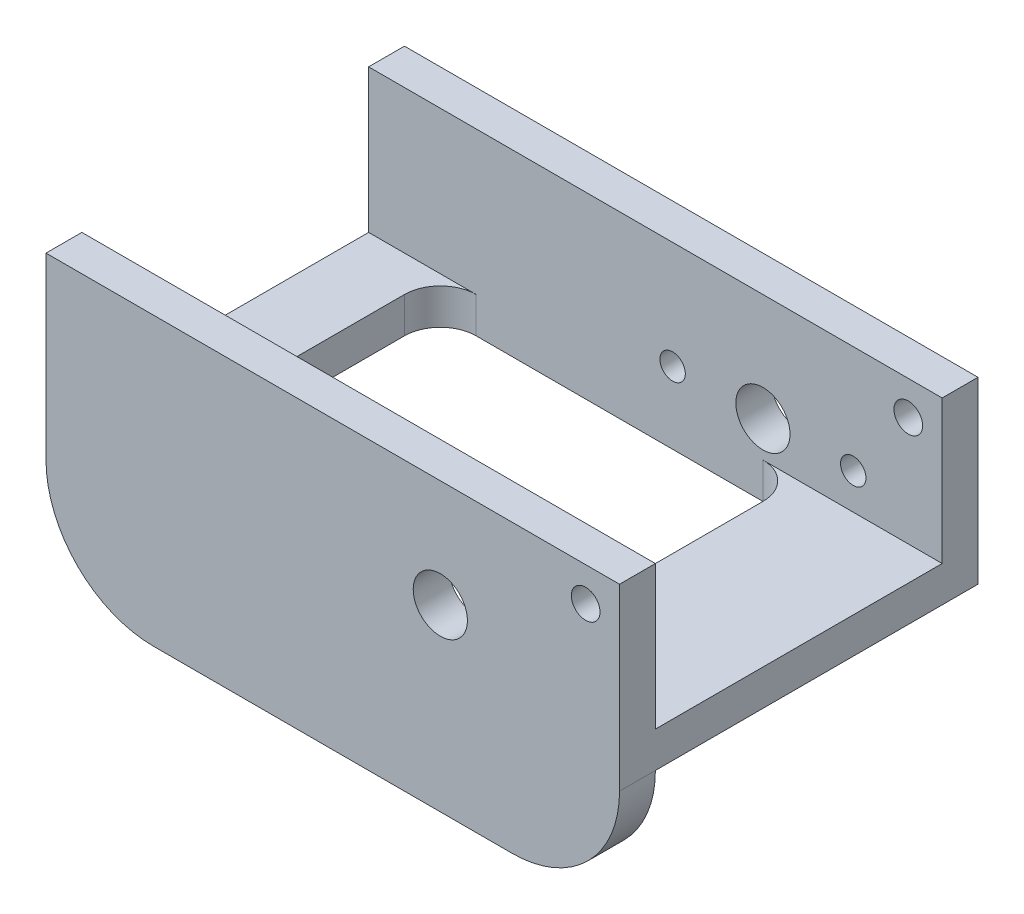
ISO-10303-21;
HEADER;
FILE_DESCRIPTION(('STEP AP214'),'2;1');
FILE_NAME('part.step','',(''),(''),'','','');
FILE_SCHEMA(('AUTOMOTIVE_DESIGN { 1 0 10303 214 1 1 1 1 }'));
ENDSEC;
DATA;
#1=APPLICATION_CONTEXT('core data for automotive mechanical design processes');
#2=APPLICATION_PROTOCOL_DEFINITION('international standard','automotive_design',2000,#1);
#3=PRODUCT_CONTEXT('',#1,'mechanical');
#4=PRODUCT('Part','Part','',(#3));
#5=PRODUCT_RELATED_PRODUCT_CATEGORY('part','',(#4));
#6=PRODUCT_DEFINITION_FORMATION('','',#4);
#7=PRODUCT_DEFINITION_CONTEXT('part definition',#1,'design');
#8=PRODUCT_DEFINITION('design','',#6,#7);
#9=PRODUCT_DEFINITION_SHAPE('','',#8);
#10=(LENGTH_UNIT() NAMED_UNIT(*) SI_UNIT(.MILLI.,.METRE.));
#11=(NAMED_UNIT(*) PLANE_ANGLE_UNIT() SI_UNIT($,.RADIAN.));
#12=(NAMED_UNIT(*) SI_UNIT($,.STERADIAN.) SOLID_ANGLE_UNIT());
#13=UNCERTAINTY_MEASURE_WITH_UNIT(LENGTH_MEASURE(1.E-05),#10,'distance_accuracy_value','');
#14=(GEOMETRIC_REPRESENTATION_CONTEXT(3) GLOBAL_UNCERTAINTY_ASSIGNED_CONTEXT((#13)) GLOBAL_UNIT_ASSIGNED_CONTEXT((#10,
#11,#12)) REPRESENTATION_CONTEXT('',''));
#15=CARTESIAN_POINT('',(0.,0.,0.));
#16=DIRECTION('',(0.,0.,1.));
#17=DIRECTION('',(1.,0.,0.));
#18=AXIS2_PLACEMENT_3D('',#15,#16,#17);
#19=CARTESIAN_POINT('',(-0.001000000000001,25.4,-57.15));
#20=DIRECTION('',(0.,-1.,0.));
#21=DIRECTION('',(0.,0.,-1.));
#22=AXIS2_PLACEMENT_3D('',#19,#20,#21);
#23=PLANE('',#22);
#24=DIRECTION('',(1.,0.,0.));
#25=VECTOR('',#24,1.);
#26=CARTESIAN_POINT('',(-0.001000000000001,25.4,-6.35));
#27=LINE('',#26,#25);
#28=CARTESIAN_POINT('',(0.,25.4,-6.35));
#29=VERTEX_POINT('',#28);
#30=CARTESIAN_POINT('',(19.05,25.4,-6.35));
#31=VERTEX_POINT('',#30);
#32=EDGE_CURVE('E340',#29,#31,#27,.T.);
#33=ORIENTED_EDGE('',*,*,#32,.T.);
#34=CARTESIAN_POINT('',(19.05,25.4,-12.7));
#35=DIRECTION('',(0.,-1.,0.));
#36=DIRECTION('',(0.,0.,-1.));
#37=AXIS2_PLACEMENT_3D('',#34,#35,#36);
#38=CIRCLE('',#37,6.35);
#39=CARTESIAN_POINT('',(12.7,25.4,-12.7));
#40=VERTEX_POINT('',#39);
#41=EDGE_CURVE('E47',#31,#40,#38,.T.);
#42=ORIENTED_EDGE('',*,*,#41,.T.);
#43=DIRECTION('',(0.,0.,1.));
#44=VECTOR('',#43,1.);
#45=CARTESIAN_POINT('',(12.7,25.4,-6.35));
#46=LINE('',#45,#44);
#47=CARTESIAN_POINT('',(12.7,25.4,-50.8));
#48=VERTEX_POINT('',#47);
#49=EDGE_CURVE('E352',#48,#40,#46,.T.);
#50=ORIENTED_EDGE('',*,*,#49,.F.);
#51=CARTESIAN_POINT('',(19.05,25.4,-50.8));
#52=DIRECTION('',(0.,-1.,0.));
#53=DIRECTION('',(0.,0.,-1.));
#54=AXIS2_PLACEMENT_3D('',#51,#52,#53);
#55=CIRCLE('',#54,6.35);
#56=CARTESIAN_POINT('',(19.05,25.4,-57.15));
#57=VERTEX_POINT('',#56);
#58=EDGE_CURVE('E61',#48,#57,#55,.T.);
#59=ORIENTED_EDGE('',*,*,#58,.T.);
#60=DIRECTION('',(1.,0.,0.));
#61=VECTOR('',#60,1.);
#62=CARTESIAN_POINT('',(-0.001000000000001,25.4,-57.15));
#63=LINE('',#62,#61);
#64=CARTESIAN_POINT('',(0.,25.4,-57.15));
#65=VERTEX_POINT('',#64);
#66=EDGE_CURVE('E217',#65,#57,#63,.T.);
#67=ORIENTED_EDGE('',*,*,#66,.F.);
#68=DIRECTION('',(0.,0.,1.));
#69=VECTOR('',#68,1.);
#70=CARTESIAN_POINT('',(0.,25.4,-57.15));
#71=LINE('',#70,#69);
#72=EDGE_CURVE('E194',#65,#29,#71,.T.);
#73=ORIENTED_EDGE('',*,*,#72,.T.);
#74=EDGE_LOOP('',(#33,#42,#50,#59,#67,#73));
#75=FACE_BOUND('',#74,.T.);
#76=ADVANCED_FACE('F39',(#75),#23,.F.);
#77=CARTESIAN_POINT('',(0.,50.8,0.));
#78=DIRECTION('',(0.,-1.,0.));
#79=DIRECTION('',(0.,0.,-1.));
#80=AXIS2_PLACEMENT_3D('',#77,#78,#79);
#81=PLANE('',#80);
#82=DIRECTION('',(0.,0.,1.));
#83=VECTOR('',#82,1.);
#84=CARTESIAN_POINT('',(0.,50.8,0.));
#85=LINE('',#84,#83);
#86=CARTESIAN_POINT('',(0.,50.8,-63.5));
#87=VERTEX_POINT('',#86);
#88=CARTESIAN_POINT('',(0.,50.8,-57.15));
#89=VERTEX_POINT('',#88);
#90=EDGE_CURVE('E191',#87,#89,#85,.T.);
#91=ORIENTED_EDGE('',*,*,#90,.T.);
#92=DIRECTION('',(1.,0.,0.));
#93=VECTOR('',#92,1.);
#94=CARTESIAN_POINT('',(-0.001000000000001,50.8,-57.15));
#95=LINE('',#94,#93);
#96=CARTESIAN_POINT('',(101.6,50.8,-57.15));
#97=VERTEX_POINT('',#96);
#98=EDGE_CURVE('E172',#89,#97,#95,.T.);
#99=ORIENTED_EDGE('',*,*,#98,.T.);
#100=DIRECTION('',(0.,0.,-1.));
#101=VECTOR('',#100,1.);
#102=CARTESIAN_POINT('',(101.6,50.8,0.));
#103=LINE('',#102,#101);
#104=CARTESIAN_POINT('',(101.6,50.8,-63.5));
#105=VERTEX_POINT('',#104);
#106=EDGE_CURVE('E203',#97,#105,#103,.T.);
#107=ORIENTED_EDGE('',*,*,#106,.T.);
#108=DIRECTION('',(-1.,0.,0.));
#109=VECTOR('',#108,1.);
#110=CARTESIAN_POINT('',(0.,50.8,-63.5));
#111=LINE('',#110,#109);
#112=EDGE_CURVE('E198',#105,#87,#111,.T.);
#113=ORIENTED_EDGE('',*,*,#112,.T.);
#114=EDGE_LOOP('',(#91,#99,#107,#113));
#115=FACE_BOUND('',#114,.T.);
#116=ADVANCED_FACE('F196',(#115),#81,.F.);
#117=CARTESIAN_POINT('',(0.,50.8,0.));
#118=DIRECTION('',(1.,0.,0.));
#119=DIRECTION('',(0.,0.,-1.));
#120=AXIS2_PLACEMENT_3D('',#117,#118,#119);
#121=PLANE('',#120);
#122=DIRECTION('',(0.,0.,-1.));
#123=VECTOR('',#122,1.);
#124=CARTESIAN_POINT('',(0.,19.05,-63.5));
#125=LINE('',#124,#123);
#126=CARTESIAN_POINT('',(0.,19.05,-6.35));
#127=VERTEX_POINT('',#126);
#128=CARTESIAN_POINT('',(0.,19.05,-63.5));
#129=VERTEX_POINT('',#128);
#130=EDGE_CURVE('E299',#127,#129,#125,.T.);
#131=ORIENTED_EDGE('',*,*,#130,.F.);
#132=DIRECTION('',(0.,0.,1.));
#133=VECTOR('',#132,1.);
#134=CARTESIAN_POINT('',(0.,19.05,0.));
#135=LINE('',#134,#133);
#136=CARTESIAN_POINT('',(0.,19.05,0.));
#137=VERTEX_POINT('',#136);
#138=EDGE_CURVE('E228',#127,#137,#135,.T.);
#139=ORIENTED_EDGE('',*,*,#138,.T.);
#140=DIRECTION('',(0.,-1.,0.));
#141=VECTOR('',#140,1.);
#142=CARTESIAN_POINT('',(0.,50.8,0.));
#143=LINE('',#142,#141);
#144=CARTESIAN_POINT('',(0.,50.8,0.));
#145=VERTEX_POINT('',#144);
#146=EDGE_CURVE('E225',#145,#137,#143,.T.);
#147=ORIENTED_EDGE('',*,*,#146,.F.);
#148=CARTESIAN_POINT('',(0.,50.8,-6.35));
#149=VERTEX_POINT('',#148);
#150=EDGE_CURVE('E201',#149,#145,#85,.T.);
#151=ORIENTED_EDGE('',*,*,#150,.F.);
#152=DIRECTION('',(0.,1.,0.));
#153=VECTOR('',#152,1.);
#154=CARTESIAN_POINT('',(0.,50.8,-6.35));
#155=LINE('',#154,#153);
#156=EDGE_CURVE('E356',#29,#149,#155,.T.);
#157=ORIENTED_EDGE('',*,*,#156,.F.);
#158=ORIENTED_EDGE('',*,*,#72,.F.);
#159=DIRECTION('',(0.,-1.,0.));
#160=VECTOR('',#159,1.);
#161=CARTESIAN_POINT('',(0.,50.8,-57.15));
#162=LINE('',#161,#160);
#163=EDGE_CURVE('E176',#89,#65,#162,.T.);
#164=ORIENTED_EDGE('',*,*,#163,.F.);
#165=ORIENTED_EDGE('',*,*,#90,.F.);
#166=DIRECTION('',(0.,-1.,0.));
#167=VECTOR('',#166,1.);
#168=CARTESIAN_POINT('',(0.,50.8,-63.5));
#169=LINE('',#168,#167);
#170=EDGE_CURVE('E214',#87,#129,#169,.T.);
#171=ORIENTED_EDGE('',*,*,#170,.T.);
#172=EDGE_LOOP('',(#131,#139,#147,#151,#157,#158,#164,#165,#171));
#173=FACE_BOUND('',#172,.T.);
#174=ADVANCED_FACE('F189',(#173),#121,.F.);
#175=CARTESIAN_POINT('',(0.,50.8,0.));
#176=DIRECTION('',(0.,0.,-1.));
#177=DIRECTION('',(-1.,0.,0.));
#178=AXIS2_PLACEMENT_3D('',#175,#176,#177);
#179=PLANE('',#178);
#180=CARTESIAN_POINT('',(95.6,44.8,0.));
#181=DIRECTION('',(0.,0.,-1.));
#182=DIRECTION('',(-1.,0.,0.));
#183=AXIS2_PLACEMENT_3D('',#180,#181,#182);
#184=CIRCLE('',#183,2.54);
#185=CARTESIAN_POINT('',(93.06,44.8,0.));
#186=VERTEX_POINT('',#185);
#187=EDGE_CURVE('E238',#186,#186,#184,.F.);
#188=ORIENTED_EDGE('',*,*,#187,.F.);
#189=EDGE_LOOP('',(#188));
#190=FACE_BOUND('',#189,.T.);
#191=CARTESIAN_POINT('',(69.85,31.75,0.));
#192=DIRECTION('',(0.,0.,-1.));
#193=DIRECTION('',(-1.,0.,0.));
#194=AXIS2_PLACEMENT_3D('',#191,#192,#193);
#195=CIRCLE('',#194,4.8);
#196=CARTESIAN_POINT('',(65.05,31.75,0.));
#197=VERTEX_POINT('',#196);
#198=EDGE_CURVE('E233',#197,#197,#195,.F.);
#199=ORIENTED_EDGE('',*,*,#198,.F.);
#200=EDGE_LOOP('',(#199));
#201=FACE_BOUND('',#200,.T.);
#202=ORIENTED_EDGE('',*,*,#146,.T.);
#203=CARTESIAN_POINT('',(19.05,19.05,0.));
#204=DIRECTION('',(0.,0.,-1.));
#205=DIRECTION('',(-1.,0.,0.));
#206=AXIS2_PLACEMENT_3D('',#203,#204,#205);
#207=CIRCLE('',#206,19.05);
#208=CARTESIAN_POINT('',(19.05,0.,0.));
#209=VERTEX_POINT('',#208);
#210=EDGE_CURVE('E243',#137,#209,#207,.F.);
#211=ORIENTED_EDGE('',*,*,#210,.T.);
#212=DIRECTION('',(1.,0.,0.));
#213=VECTOR('',#212,1.);
#214=CARTESIAN_POINT('',(0.,0.,0.));
#215=LINE('',#214,#213);
#216=CARTESIAN_POINT('',(82.55,0.,0.));
#217=VERTEX_POINT('',#216);
#218=EDGE_CURVE('E205',#209,#217,#215,.T.);
#219=ORIENTED_EDGE('',*,*,#218,.T.);
#220=CARTESIAN_POINT('',(82.55,19.05,0.));
#221=DIRECTION('',(0.,0.,-1.));
#222=DIRECTION('',(-1.,0.,0.));
#223=AXIS2_PLACEMENT_3D('',#220,#221,#222);
#224=CIRCLE('',#223,19.05);
#225=CARTESIAN_POINT('',(101.6,19.05,0.));
#226=VERTEX_POINT('',#225);
#227=EDGE_CURVE('E241',#217,#226,#224,.F.);
#228=ORIENTED_EDGE('',*,*,#227,.T.);
#229=DIRECTION('',(0.,-1.,0.));
#230=VECTOR('',#229,1.);
#231=CARTESIAN_POINT('',(101.6,50.8,0.));
#232=LINE('',#231,#230);
#233=CARTESIAN_POINT('',(101.6,50.8,0.));
#234=VERTEX_POINT('',#233);
#235=EDGE_CURVE('E222',#234,#226,#232,.T.);
#236=ORIENTED_EDGE('',*,*,#235,.F.);
#237=DIRECTION('',(1.,0.,0.));
#238=VECTOR('',#237,1.);
#239=CARTESIAN_POINT('',(0.,50.8,0.));
#240=LINE('',#239,#238);
#241=EDGE_CURVE('E200',#145,#234,#240,.T.);
#242=ORIENTED_EDGE('',*,*,#241,.F.);
#243=EDGE_LOOP('',(#202,#211,#219,#228,#236,#242));
#244=FACE_BOUND('',#243,.T.);
#245=ADVANCED_FACE('F399',(#190,#201,#244),#179,.F.);
#246=CARTESIAN_POINT('',(101.6,50.8,0.));
#247=DIRECTION('',(-1.,0.,0.));
#248=DIRECTION('',(0.,0.,1.));
#249=AXIS2_PLACEMENT_3D('',#246,#247,#248);
#250=PLANE('',#249);
#251=ORIENTED_EDGE('',*,*,#235,.T.);
#252=DIRECTION('',(0.,0.,-1.));
#253=VECTOR('',#252,1.);
#254=CARTESIAN_POINT('',(101.6,19.05,-6.35));
#255=LINE('',#254,#253);
#256=CARTESIAN_POINT('',(101.6,19.05,-6.35));
#257=VERTEX_POINT('',#256);
#258=EDGE_CURVE('E253',#226,#257,#255,.T.);
#259=ORIENTED_EDGE('',*,*,#258,.T.);
#260=DIRECTION('',(0.,0.,1.));
#261=VECTOR('',#260,1.);
#262=CARTESIAN_POINT('',(101.6,19.05,-63.5));
#263=LINE('',#262,#261);
#264=CARTESIAN_POINT('',(101.6,19.05,-63.5));
#265=VERTEX_POINT('',#264);
#266=EDGE_CURVE('E207',#265,#257,#263,.T.);
#267=ORIENTED_EDGE('',*,*,#266,.F.);
#268=DIRECTION('',(0.,-1.,0.));
#269=VECTOR('',#268,1.);
#270=CARTESIAN_POINT('',(101.6,50.8,-63.5));
#271=LINE('',#270,#269);
#272=EDGE_CURVE('E219',#105,#265,#271,.T.);
#273=ORIENTED_EDGE('',*,*,#272,.F.);
#274=ORIENTED_EDGE('',*,*,#106,.F.);
#275=DIRECTION('',(0.,1.,0.));
#276=VECTOR('',#275,1.);
#277=CARTESIAN_POINT('',(101.6,50.8,-57.15));
#278=LINE('',#277,#276);
#279=CARTESIAN_POINT('',(101.6,25.4,-57.15));
#280=VERTEX_POINT('',#279);
#281=EDGE_CURVE('E179',#280,#97,#278,.T.);
#282=ORIENTED_EDGE('',*,*,#281,.F.);
#283=DIRECTION('',(0.,0.,-1.));
#284=VECTOR('',#283,1.);
#285=CARTESIAN_POINT('',(101.6,25.4,-57.15));
#286=LINE('',#285,#284);
#287=CARTESIAN_POINT('',(101.6,25.4,-6.35));
#288=VERTEX_POINT('',#287);
#289=EDGE_CURVE('E184',#288,#280,#286,.T.);
#290=ORIENTED_EDGE('',*,*,#289,.F.);
#291=DIRECTION('',(0.,-1.,0.));
#292=VECTOR('',#291,1.);
#293=CARTESIAN_POINT('',(101.6,50.8,-6.35));
#294=LINE('',#293,#292);
#295=CARTESIAN_POINT('',(101.6,50.8,-6.35));
#296=VERTEX_POINT('',#295);
#297=EDGE_CURVE('E360',#296,#288,#294,.T.);
#298=ORIENTED_EDGE('',*,*,#297,.F.);
#299=EDGE_CURVE('E210',#234,#296,#103,.T.);
#300=ORIENTED_EDGE('',*,*,#299,.F.);
#301=EDGE_LOOP('',(#251,#259,#267,#273,#274,#282,#290,#298,#300));
#302=FACE_BOUND('',#301,.T.);
#303=ADVANCED_FACE('F386',(#302),#250,.F.);
#304=CARTESIAN_POINT('',(0.,50.8,-63.5));
#305=DIRECTION('',(0.,0.,1.));
#306=DIRECTION('',(1.,0.,0.));
#307=AXIS2_PLACEMENT_3D('',#304,#305,#306);
#308=PLANE('',#307);
#309=CARTESIAN_POINT('',(95.6,44.8,-63.5));
#310=DIRECTION('',(0.,0.,-1.));
#311=DIRECTION('',(-1.,0.,0.));
#312=AXIS2_PLACEMENT_3D('',#309,#310,#311);
#313=CIRCLE('',#312,2.54);
#314=CARTESIAN_POINT('',(93.06,44.8,-63.5));
#315=VERTEX_POINT('',#314);
#316=EDGE_CURVE('E451',#315,#315,#313,.T.);
#317=ORIENTED_EDGE('',*,*,#316,.F.);
#318=EDGE_LOOP('',(#317));
#319=FACE_BOUND('',#318,.T.);
#320=CARTESIAN_POINT('',(69.85,31.75,-63.5));
#321=DIRECTION('',(0.,0.,-1.));
#322=DIRECTION('',(-1.,0.,0.));
#323=AXIS2_PLACEMENT_3D('',#320,#321,#322);
#324=CIRCLE('',#323,4.8);
#325=CARTESIAN_POINT('',(65.05,31.75,-63.5));
#326=VERTEX_POINT('',#325);
#327=EDGE_CURVE('E454',#326,#326,#324,.T.);
#328=ORIENTED_EDGE('',*,*,#327,.F.);
#329=EDGE_LOOP('',(#328));
#330=FACE_BOUND('',#329,.T.);
#331=CARTESIAN_POINT('',(85.85,31.75,-63.5));
#332=DIRECTION('',(0.,0.,-1.));
#333=DIRECTION('',(-1.,0.,0.));
#334=AXIS2_PLACEMENT_3D('',#331,#332,#333);
#335=CIRCLE('',#334,2.25);
#336=CARTESIAN_POINT('',(83.6,31.75,-63.5));
#337=VERTEX_POINT('',#336);
#338=EDGE_CURVE('E466',#337,#337,#335,.T.);
#339=ORIENTED_EDGE('',*,*,#338,.F.);
#340=EDGE_LOOP('',(#339));
#341=FACE_BOUND('',#340,.T.);
#342=CARTESIAN_POINT('',(53.85,31.75,-63.5));
#343=DIRECTION('',(0.,0.,-1.));
#344=DIRECTION('',(-1.,0.,0.));
#345=AXIS2_PLACEMENT_3D('',#342,#343,#344);
#346=CIRCLE('',#345,2.25);
#347=CARTESIAN_POINT('',(51.6,31.75,-63.5));
#348=VERTEX_POINT('',#347);
#349=EDGE_CURVE('E465',#348,#348,#346,.T.);
#350=ORIENTED_EDGE('',*,*,#349,.F.);
#351=EDGE_LOOP('',(#350));
#352=FACE_BOUND('',#351,.T.);
#353=ORIENTED_EDGE('',*,*,#272,.T.);
#354=DIRECTION('',(1.,0.,0.));
#355=VECTOR('',#354,1.);
#356=CARTESIAN_POINT('',(-0.001000000000001,19.05,-63.5));
#357=LINE('',#356,#355);
#358=EDGE_CURVE('E369',#129,#265,#357,.T.);
#359=ORIENTED_EDGE('',*,*,#358,.F.);
#360=ORIENTED_EDGE('',*,*,#170,.F.);
#361=ORIENTED_EDGE('',*,*,#112,.F.);
#362=EDGE_LOOP('',(#353,#359,#360,#361));
#363=FACE_BOUND('',#362,.T.);
#364=ADVANCED_FACE('F389',(#319,#330,#341,#352,#363),#308,.F.);
#365=ORIENTED_EDGE('',*,*,#299,.T.);
#366=DIRECTION('',(1.,0.,0.));
#367=VECTOR('',#366,1.);
#368=CARTESIAN_POINT('',(-0.001000000000001,50.8,-6.35));
#369=LINE('',#368,#367);
#370=EDGE_CURVE('E183',#149,#296,#369,.T.);
#371=ORIENTED_EDGE('',*,*,#370,.F.);
#372=ORIENTED_EDGE('',*,*,#150,.T.);
#373=ORIENTED_EDGE('',*,*,#241,.T.);
#374=EDGE_LOOP('',(#365,#371,#372,#373));
#375=FACE_BOUND('',#374,.T.);
#376=ADVANCED_FACE('F321',(#375),#81,.F.);
#377=CARTESIAN_POINT('',(0.,0.,0.));
#378=DIRECTION('',(0.,-1.,0.));
#379=DIRECTION('',(0.,0.,-1.));
#380=AXIS2_PLACEMENT_3D('',#377,#378,#379);
#381=PLANE('',#380);
#382=ORIENTED_EDGE('',*,*,#218,.F.);
#383=DIRECTION('',(0.,0.,1.));
#384=VECTOR('',#383,1.);
#385=CARTESIAN_POINT('',(19.05,0.,-6.35));
#386=LINE('',#385,#384);
#387=CARTESIAN_POINT('',(19.05,0.,-6.35));
#388=VERTEX_POINT('',#387);
#389=EDGE_CURVE('E247',#209,#388,#386,.F.);
#390=ORIENTED_EDGE('',*,*,#389,.T.);
#391=DIRECTION('',(1.,0.,0.));
#392=VECTOR('',#391,1.);
#393=CARTESIAN_POINT('',(-0.001000000000001,0.,-6.35));
#394=LINE('',#393,#392);
#395=CARTESIAN_POINT('',(82.55,0.,-6.35));
#396=VERTEX_POINT('',#395);
#397=EDGE_CURVE('E368',#388,#396,#394,.T.);
#398=ORIENTED_EDGE('',*,*,#397,.T.);
#399=DIRECTION('',(0.,0.,-1.));
#400=VECTOR('',#399,1.);
#401=CARTESIAN_POINT('',(82.55,0.,0.));
#402=LINE('',#401,#400);
#403=EDGE_CURVE('E245',#396,#217,#402,.F.);
#404=ORIENTED_EDGE('',*,*,#403,.T.);
#405=EDGE_LOOP('',(#382,#390,#398,#404));
#406=FACE_BOUND('',#405,.T.);
#407=ADVANCED_FACE('F402',(#406),#381,.T.);
#408=CARTESIAN_POINT('',(-0.001000000000001,19.05,-63.5));
#409=DIRECTION('',(0.,1.,0.));
#410=DIRECTION('',(0.,0.,1.));
#411=AXIS2_PLACEMENT_3D('',#408,#409,#410);
#412=PLANE('',#411);
#413=DIRECTION('',(1.,0.,0.));
#414=VECTOR('',#413,1.);
#415=CARTESIAN_POINT('',(12.7,19.05,-57.15));
#416=LINE('',#415,#414);
#417=CARTESIAN_POINT('',(19.05,19.05,-57.15));
#418=VERTEX_POINT('',#417);
#419=CARTESIAN_POINT('',(69.85,19.05,-57.15));
#420=VERTEX_POINT('',#419);
#421=EDGE_CURVE('E295',#418,#420,#416,.T.);
#422=ORIENTED_EDGE('',*,*,#421,.F.);
#423=CARTESIAN_POINT('',(19.05,19.05,-50.8));
#424=DIRECTION('',(0.,1.,0.));
#425=DIRECTION('',(0.,0.,1.));
#426=AXIS2_PLACEMENT_3D('',#423,#424,#425);
#427=CIRCLE('',#426,6.35);
#428=CARTESIAN_POINT('',(12.7,19.05,-50.8));
#429=VERTEX_POINT('',#428);
#430=EDGE_CURVE('E286',#418,#429,#427,.T.);
#431=ORIENTED_EDGE('',*,*,#430,.T.);
#432=DIRECTION('',(0.,0.,-1.));
#433=VECTOR('',#432,1.);
#434=CARTESIAN_POINT('',(12.7,19.05,-6.35000000000001));
#435=LINE('',#434,#433);
#436=CARTESIAN_POINT('',(12.7,19.05,-12.7));
#437=VERTEX_POINT('',#436);
#438=EDGE_CURVE('E293',#437,#429,#435,.T.);
#439=ORIENTED_EDGE('',*,*,#438,.F.);
#440=CARTESIAN_POINT('',(19.05,19.05,-12.7));
#441=DIRECTION('',(0.,1.,0.));
#442=DIRECTION('',(0.,0.,1.));
#443=AXIS2_PLACEMENT_3D('',#440,#441,#442);
#444=CIRCLE('',#443,6.35);
#445=CARTESIAN_POINT('',(19.05,19.05,-6.35));
#446=VERTEX_POINT('',#445);
#447=EDGE_CURVE('E11',#437,#446,#444,.T.);
#448=ORIENTED_EDGE('',*,*,#447,.T.);
#449=DIRECTION('',(1.,0.,0.));
#450=VECTOR('',#449,1.);
#451=CARTESIAN_POINT('',(-0.001000000000001,19.05,-6.35));
#452=LINE('',#451,#450);
#453=EDGE_CURVE('E371',#127,#446,#452,.T.);
#454=ORIENTED_EDGE('',*,*,#453,.F.);
#455=ORIENTED_EDGE('',*,*,#130,.T.);
#456=ORIENTED_EDGE('',*,*,#358,.T.);
#457=ORIENTED_EDGE('',*,*,#266,.T.);
#458=CARTESIAN_POINT('',(69.85,19.05,-6.35));
#459=VERTEX_POINT('',#458);
#460=EDGE_CURVE('E372',#459,#257,#452,.T.);
#461=ORIENTED_EDGE('',*,*,#460,.F.);
#462=CARTESIAN_POINT('',(69.85,19.05,-12.7));
#463=DIRECTION('',(0.,1.,0.));
#464=DIRECTION('',(0.,0.,1.));
#465=AXIS2_PLACEMENT_3D('',#462,#463,#464);
#466=CIRCLE('',#465,6.35);
#467=CARTESIAN_POINT('',(76.2,19.05,-12.7));
#468=VERTEX_POINT('',#467);
#469=EDGE_CURVE('E279',#459,#468,#466,.T.);
#470=ORIENTED_EDGE('',*,*,#469,.T.);
#471=DIRECTION('',(0.,0.,1.));
#472=VECTOR('',#471,1.);
#473=CARTESIAN_POINT('',(76.2,19.05,-6.35000000000001));
#474=LINE('',#473,#472);
#475=CARTESIAN_POINT('',(76.2,19.05,-50.8));
#476=VERTEX_POINT('',#475);
#477=EDGE_CURVE('E345',#476,#468,#474,.T.);
#478=ORIENTED_EDGE('',*,*,#477,.F.);
#479=CARTESIAN_POINT('',(69.85,19.05,-50.8));
#480=DIRECTION('',(0.,1.,0.));
#481=DIRECTION('',(0.,0.,1.));
#482=AXIS2_PLACEMENT_3D('',#479,#480,#481);
#483=CIRCLE('',#482,6.35);
#484=EDGE_CURVE('E283',#476,#420,#483,.T.);
#485=ORIENTED_EDGE('',*,*,#484,.T.);
#486=EDGE_LOOP('',(#422,#431,#439,#448,#454,#455,#456,#457,#461,#470,#478,#485));
#487=FACE_BOUND('',#486,.T.);
#488=ADVANCED_FACE('F292',(#487),#412,.F.);
#489=CARTESIAN_POINT('',(-0.001000000000001,50.8,-57.15));
#490=DIRECTION('',(0.,0.,-1.));
#491=DIRECTION('',(-1.,0.,0.));
#492=AXIS2_PLACEMENT_3D('',#489,#490,#491);
#493=PLANE('',#492);
#494=CARTESIAN_POINT('',(95.6,44.8,-57.15));
#495=DIRECTION('',(0.,0.,-1.));
#496=DIRECTION('',(-1.,0.,0.));
#497=AXIS2_PLACEMENT_3D('',#494,#495,#496);
#498=CIRCLE('',#497,2.54);
#499=CARTESIAN_POINT('',(93.06,44.8,-57.15));
#500=VERTEX_POINT('',#499);
#501=EDGE_CURVE('E237',#500,#500,#498,.T.);
#502=ORIENTED_EDGE('',*,*,#501,.T.);
#503=EDGE_LOOP('',(#502));
#504=FACE_BOUND('',#503,.T.);
#505=CARTESIAN_POINT('',(69.85,31.75,-57.15));
#506=DIRECTION('',(0.,0.,-1.));
#507=DIRECTION('',(-1.,0.,0.));
#508=AXIS2_PLACEMENT_3D('',#505,#506,#507);
#509=CIRCLE('',#508,4.8);
#510=CARTESIAN_POINT('',(65.05,31.75,-57.15));
#511=VERTEX_POINT('',#510);
#512=EDGE_CURVE('E232',#511,#511,#509,.T.);
#513=ORIENTED_EDGE('',*,*,#512,.T.);
#514=EDGE_LOOP('',(#513));
#515=FACE_BOUND('',#514,.T.);
#516=CARTESIAN_POINT('',(85.85,31.75,-57.15));
#517=DIRECTION('',(0.,0.,-1.));
#518=DIRECTION('',(-1.,0.,0.));
#519=AXIS2_PLACEMENT_3D('',#516,#517,#518);
#520=CIRCLE('',#519,2.25);
#521=CARTESIAN_POINT('',(83.6,31.75,-57.15));
#522=VERTEX_POINT('',#521);
#523=EDGE_CURVE('E354',#522,#522,#520,.F.);
#524=ORIENTED_EDGE('',*,*,#523,.F.);
#525=EDGE_LOOP('',(#524));
#526=FACE_BOUND('',#525,.T.);
#527=CARTESIAN_POINT('',(53.85,31.75,-57.15));
#528=DIRECTION('',(0.,0.,-1.));
#529=DIRECTION('',(-1.,0.,0.));
#530=AXIS2_PLACEMENT_3D('',#527,#528,#529);
#531=CIRCLE('',#530,2.25);
#532=CARTESIAN_POINT('',(51.6,31.75,-57.15));
#533=VERTEX_POINT('',#532);
#534=EDGE_CURVE('E469',#533,#533,#531,.F.);
#535=ORIENTED_EDGE('',*,*,#534,.F.);
#536=EDGE_LOOP('',(#535));
#537=FACE_BOUND('',#536,.T.);
#538=ORIENTED_EDGE('',*,*,#421,.T.);
#539=DIRECTION('',(0.,1.,0.));
#540=VECTOR('',#539,1.);
#541=CARTESIAN_POINT('',(69.85,25.4,-57.15));
#542=LINE('',#541,#540);
#543=CARTESIAN_POINT('',(69.85,25.4,-57.15));
#544=VERTEX_POINT('',#543);
#545=EDGE_CURVE('E269',#420,#544,#542,.T.);
#546=ORIENTED_EDGE('',*,*,#545,.T.);
#547=EDGE_CURVE('E335',#544,#280,#63,.T.);
#548=ORIENTED_EDGE('',*,*,#547,.T.);
#549=ORIENTED_EDGE('',*,*,#281,.T.);
#550=ORIENTED_EDGE('',*,*,#98,.F.);
#551=ORIENTED_EDGE('',*,*,#163,.T.);
#552=ORIENTED_EDGE('',*,*,#66,.T.);
#553=DIRECTION('',(0.,1.,0.));
#554=VECTOR('',#553,1.);
#555=CARTESIAN_POINT('',(19.05,19.05,-57.15));
#556=LINE('',#555,#554);
#557=EDGE_CURVE('E267',#57,#418,#556,.F.);
#558=ORIENTED_EDGE('',*,*,#557,.T.);
#559=EDGE_LOOP('',(#538,#546,#548,#549,#550,#551,#552,#558));
#560=FACE_BOUND('',#559,.T.);
#561=ADVANCED_FACE('F175',(#504,#515,#526,#537,#560),#493,.F.);
#562=ORIENTED_EDGE('',*,*,#547,.F.);
#563=CARTESIAN_POINT('',(69.85,25.4,-50.8));
#564=DIRECTION('',(0.,-1.,0.));
#565=DIRECTION('',(0.,0.,-1.));
#566=AXIS2_PLACEMENT_3D('',#563,#564,#565);
#567=CIRCLE('',#566,6.35);
#568=CARTESIAN_POINT('',(76.2,25.4,-50.8));
#569=VERTEX_POINT('',#568);
#570=EDGE_CURVE('E281',#544,#569,#567,.T.);
#571=ORIENTED_EDGE('',*,*,#570,.T.);
#572=DIRECTION('',(0.,0.,-1.));
#573=VECTOR('',#572,1.);
#574=CARTESIAN_POINT('',(76.2,25.4,-6.35));
#575=LINE('',#574,#573);
#576=CARTESIAN_POINT('',(76.2,25.4,-12.7));
#577=VERTEX_POINT('',#576);
#578=EDGE_CURVE('E348',#577,#569,#575,.T.);
#579=ORIENTED_EDGE('',*,*,#578,.F.);
#580=CARTESIAN_POINT('',(69.85,25.4,-12.7));
#581=DIRECTION('',(0.,-1.,0.));
#582=DIRECTION('',(0.,0.,-1.));
#583=AXIS2_PLACEMENT_3D('',#580,#581,#582);
#584=CIRCLE('',#583,6.35);
#585=CARTESIAN_POINT('',(69.85,25.4,-6.35));
#586=VERTEX_POINT('',#585);
#587=EDGE_CURVE('E276',#577,#586,#584,.T.);
#588=ORIENTED_EDGE('',*,*,#587,.T.);
#589=EDGE_CURVE('E365',#586,#288,#27,.T.);
#590=ORIENTED_EDGE('',*,*,#589,.T.);
#591=ORIENTED_EDGE('',*,*,#289,.T.);
#592=EDGE_LOOP('',(#562,#571,#579,#588,#590,#591));
#593=FACE_BOUND('',#592,.T.);
#594=ADVANCED_FACE('F314',(#593),#23,.F.);
#595=CARTESIAN_POINT('',(-0.001000000000001,50.8,-6.35));
#596=DIRECTION('',(0.,0.,1.));
#597=DIRECTION('',(0.,-1.,0.));
#598=AXIS2_PLACEMENT_3D('',#595,#596,#597);
#599=PLANE('',#598);
#600=CARTESIAN_POINT('',(95.6,44.8,-6.35));
#601=DIRECTION('',(0.,0.,1.));
#602=DIRECTION('',(0.,-1.,0.));
#603=AXIS2_PLACEMENT_3D('',#600,#601,#602);
#604=CIRCLE('',#603,2.54);
#605=CARTESIAN_POINT('',(95.6,42.26,-6.35));
#606=VERTEX_POINT('',#605);
#607=EDGE_CURVE('E234',#606,#606,#604,.T.);
#608=ORIENTED_EDGE('',*,*,#607,.T.);
#609=EDGE_LOOP('',(#608));
#610=FACE_BOUND('',#609,.T.);
#611=CARTESIAN_POINT('',(69.85,31.75,-6.35));
#612=DIRECTION('',(0.,0.,1.));
#613=DIRECTION('',(0.,-1.,0.));
#614=AXIS2_PLACEMENT_3D('',#611,#612,#613);
#615=CIRCLE('',#614,4.8);
#616=CARTESIAN_POINT('',(69.85,26.95,-6.35000000000001));
#617=VERTEX_POINT('',#616);
#618=EDGE_CURVE('E229',#617,#617,#615,.T.);
#619=ORIENTED_EDGE('',*,*,#618,.T.);
#620=EDGE_LOOP('',(#619));
#621=FACE_BOUND('',#620,.T.);
#622=ORIENTED_EDGE('',*,*,#589,.F.);
#623=DIRECTION('',(0.,1.,0.));
#624=VECTOR('',#623,1.);
#625=CARTESIAN_POINT('',(69.85,19.05,-6.35));
#626=LINE('',#625,#624);
#627=EDGE_CURVE('E264',#586,#459,#626,.F.);
#628=ORIENTED_EDGE('',*,*,#627,.T.);
#629=ORIENTED_EDGE('',*,*,#460,.T.);
#630=CARTESIAN_POINT('',(82.55,19.05,-6.35));
#631=DIRECTION('',(0.,0.,1.));
#632=DIRECTION('',(0.,-1.,0.));
#633=AXIS2_PLACEMENT_3D('',#630,#631,#632);
#634=CIRCLE('',#633,19.05);
#635=EDGE_CURVE('E249',#257,#396,#634,.F.);
#636=ORIENTED_EDGE('',*,*,#635,.T.);
#637=ORIENTED_EDGE('',*,*,#397,.F.);
#638=CARTESIAN_POINT('',(19.05,19.05,-6.35));
#639=DIRECTION('',(0.,0.,1.));
#640=DIRECTION('',(0.,-1.,0.));
#641=AXIS2_PLACEMENT_3D('',#638,#639,#640);
#642=CIRCLE('',#641,19.05);
#643=EDGE_CURVE('E251',#388,#127,#642,.F.);
#644=ORIENTED_EDGE('',*,*,#643,.T.);
#645=ORIENTED_EDGE('',*,*,#453,.T.);
#646=DIRECTION('',(0.,1.,0.));
#647=VECTOR('',#646,1.);
#648=CARTESIAN_POINT('',(19.05,25.4,-6.35));
#649=LINE('',#648,#647);
#650=EDGE_CURVE('E261',#446,#31,#649,.T.);
#651=ORIENTED_EDGE('',*,*,#650,.T.);
#652=ORIENTED_EDGE('',*,*,#32,.F.);
#653=ORIENTED_EDGE('',*,*,#156,.T.);
#654=ORIENTED_EDGE('',*,*,#370,.T.);
#655=ORIENTED_EDGE('',*,*,#297,.T.);
#656=EDGE_LOOP('',(#622,#628,#629,#636,#637,#644,#645,#651,#652,#653,#654,#655));
#657=FACE_BOUND('',#656,.T.);
#658=ADVANCED_FACE('F325',(#610,#621,#657),#599,.F.);
#659=CARTESIAN_POINT('',(12.7,-62.2696778153972,-6.35000000000002));
#660=DIRECTION('',(-1.,0.,0.));
#661=DIRECTION('',(0.,0.,1.));
#662=AXIS2_PLACEMENT_3D('',#659,#660,#661);
#663=PLANE('',#662);
#664=ORIENTED_EDGE('',*,*,#438,.T.);
#665=DIRECTION('',(0.,1.,0.));
#666=VECTOR('',#665,1.);
#667=CARTESIAN_POINT('',(12.7,25.4,-50.8));
#668=LINE('',#667,#666);
#669=EDGE_CURVE('E274',#429,#48,#668,.T.);
#670=ORIENTED_EDGE('',*,*,#669,.T.);
#671=ORIENTED_EDGE('',*,*,#49,.T.);
#672=DIRECTION('',(0.,1.,0.));
#673=VECTOR('',#672,1.);
#674=CARTESIAN_POINT('',(12.7,19.05,-12.7));
#675=LINE('',#674,#673);
#676=EDGE_CURVE('E272',#40,#437,#675,.F.);
#677=ORIENTED_EDGE('',*,*,#676,.T.);
#678=EDGE_LOOP('',(#664,#670,#671,#677));
#679=FACE_BOUND('',#678,.T.);
#680=ADVANCED_FACE('F297',(#679),#663,.F.);
#681=CARTESIAN_POINT('',(76.2,-62.2696778153972,-6.35000000000002));
#682=DIRECTION('',(1.,0.,0.));
#683=DIRECTION('',(0.,0.,-1.));
#684=AXIS2_PLACEMENT_3D('',#681,#682,#683);
#685=PLANE('',#684);
#686=ORIENTED_EDGE('',*,*,#477,.T.);
#687=DIRECTION('',(0.,1.,0.));
#688=VECTOR('',#687,1.);
#689=CARTESIAN_POINT('',(76.2,25.4,-12.7));
#690=LINE('',#689,#688);
#691=EDGE_CURVE('E258',#468,#577,#690,.T.);
#692=ORIENTED_EDGE('',*,*,#691,.T.);
#693=ORIENTED_EDGE('',*,*,#578,.T.);
#694=DIRECTION('',(0.,1.,0.));
#695=VECTOR('',#694,1.);
#696=CARTESIAN_POINT('',(76.2,19.05,-50.8));
#697=LINE('',#696,#695);
#698=EDGE_CURVE('E256',#569,#476,#697,.F.);
#699=ORIENTED_EDGE('',*,*,#698,.T.);
#700=EDGE_LOOP('',(#686,#692,#693,#699));
#701=FACE_BOUND('',#700,.T.);
#702=ADVANCED_FACE('F416',(#701),#685,.F.);
#703=CARTESIAN_POINT('',(53.85,31.75,0.001000000000001));
#704=DIRECTION('',(0.,0.,-1.));
#705=DIRECTION('',(-1.,0.,0.));
#706=AXIS2_PLACEMENT_3D('',#703,#704,#705);
#707=CYLINDRICAL_SURFACE('',#706,2.25);
#708=ORIENTED_EDGE('',*,*,#349,.T.);
#709=EDGE_LOOP('',(#708));
#710=FACE_BOUND('',#709,.T.);
#711=ORIENTED_EDGE('',*,*,#534,.T.);
#712=EDGE_LOOP('',(#711));
#713=FACE_BOUND('',#712,.T.);
#714=ADVANCED_FACE('F418',(#710,#713),#707,.F.);
#715=CARTESIAN_POINT('',(85.85,31.75,0.001000000000001));
#716=DIRECTION('',(0.,0.,-1.));
#717=DIRECTION('',(-1.,0.,0.));
#718=AXIS2_PLACEMENT_3D('',#715,#716,#717);
#719=CYLINDRICAL_SURFACE('',#718,2.25);
#720=ORIENTED_EDGE('',*,*,#338,.T.);
#721=EDGE_LOOP('',(#720));
#722=FACE_BOUND('',#721,.T.);
#723=ORIENTED_EDGE('',*,*,#523,.T.);
#724=EDGE_LOOP('',(#723));
#725=FACE_BOUND('',#724,.T.);
#726=ADVANCED_FACE('F425',(#722,#725),#719,.F.);
#727=CARTESIAN_POINT('',(69.85,31.75,13.5764501987817));
#728=DIRECTION('',(0.,0.,-1.));
#729=DIRECTION('',(-1.,0.,0.));
#730=AXIS2_PLACEMENT_3D('',#727,#728,#729);
#731=CYLINDRICAL_SURFACE('',#730,4.8);
#732=ORIENTED_EDGE('',*,*,#198,.T.);
#733=EDGE_LOOP('',(#732));
#734=FACE_BOUND('',#733,.T.);
#735=ORIENTED_EDGE('',*,*,#618,.F.);
#736=EDGE_LOOP('',(#735));
#737=FACE_BOUND('',#736,.T.);
#738=ADVANCED_FACE('F431',(#734,#737),#731,.F.);
#739=ORIENTED_EDGE('',*,*,#327,.T.);
#740=EDGE_LOOP('',(#739));
#741=FACE_BOUND('',#740,.T.);
#742=ORIENTED_EDGE('',*,*,#512,.F.);
#743=EDGE_LOOP('',(#742));
#744=FACE_BOUND('',#743,.T.);
#745=ADVANCED_FACE('F433',(#741,#744),#731,.F.);
#746=CARTESIAN_POINT('',(95.6,44.8,7.18420489685531));
#747=DIRECTION('',(0.,0.,-1.));
#748=DIRECTION('',(-1.,0.,0.));
#749=AXIS2_PLACEMENT_3D('',#746,#747,#748);
#750=CYLINDRICAL_SURFACE('',#749,2.54);
#751=ORIENTED_EDGE('',*,*,#187,.T.);
#752=EDGE_LOOP('',(#751));
#753=FACE_BOUND('',#752,.T.);
#754=ORIENTED_EDGE('',*,*,#607,.F.);
#755=EDGE_LOOP('',(#754));
#756=FACE_BOUND('',#755,.T.);
#757=ADVANCED_FACE('F436',(#753,#756),#750,.F.);
#758=ORIENTED_EDGE('',*,*,#316,.T.);
#759=EDGE_LOOP('',(#758));
#760=FACE_BOUND('',#759,.T.);
#761=ORIENTED_EDGE('',*,*,#501,.F.);
#762=EDGE_LOOP('',(#761));
#763=FACE_BOUND('',#762,.T.);
#764=ADVANCED_FACE('F438',(#760,#763),#750,.F.);
#765=CARTESIAN_POINT('',(19.05,19.05,0.));
#766=DIRECTION('',(0.,0.,-1.));
#767=DIRECTION('',(-1.,0.,0.));
#768=AXIS2_PLACEMENT_3D('',#765,#766,#767);
#769=CYLINDRICAL_SURFACE('',#768,19.05);
#770=ORIENTED_EDGE('',*,*,#643,.F.);
#771=ORIENTED_EDGE('',*,*,#389,.F.);
#772=ORIENTED_EDGE('',*,*,#210,.F.);
#773=ORIENTED_EDGE('',*,*,#138,.F.);
#774=EDGE_LOOP('',(#770,#771,#772,#773));
#775=FACE_BOUND('',#774,.T.);
#776=ADVANCED_FACE('F395',(#775),#769,.T.);
#777=CARTESIAN_POINT('',(82.55,19.05,0.));
#778=DIRECTION('',(0.,0.,1.));
#779=DIRECTION('',(1.,0.,0.));
#780=AXIS2_PLACEMENT_3D('',#777,#778,#779);
#781=CYLINDRICAL_SURFACE('',#780,19.05);
#782=ORIENTED_EDGE('',*,*,#227,.F.);
#783=ORIENTED_EDGE('',*,*,#403,.F.);
#784=ORIENTED_EDGE('',*,*,#635,.F.);
#785=ORIENTED_EDGE('',*,*,#258,.F.);
#786=EDGE_LOOP('',(#782,#783,#784,#785));
#787=FACE_BOUND('',#786,.T.);
#788=ADVANCED_FACE('F404',(#787),#781,.T.);
#789=CARTESIAN_POINT('',(69.85,-62.2696778153972,-12.7));
#790=DIRECTION('',(0.,-1.,0.));
#791=DIRECTION('',(0.,0.,-1.));
#792=AXIS2_PLACEMENT_3D('',#789,#790,#791);
#793=CYLINDRICAL_SURFACE('',#792,6.35);
#794=ORIENTED_EDGE('',*,*,#469,.F.);
#795=ORIENTED_EDGE('',*,*,#627,.F.);
#796=ORIENTED_EDGE('',*,*,#587,.F.);
#797=ORIENTED_EDGE('',*,*,#691,.F.);
#798=EDGE_LOOP('',(#794,#795,#796,#797));
#799=FACE_BOUND('',#798,.T.);
#800=ADVANCED_FACE('F309',(#799),#793,.F.);
#801=CARTESIAN_POINT('',(69.85,50.8,-50.8));
#802=DIRECTION('',(0.,-1.,0.));
#803=DIRECTION('',(0.,0.,-1.));
#804=AXIS2_PLACEMENT_3D('',#801,#802,#803);
#805=CYLINDRICAL_SURFACE('',#804,6.35);
#806=ORIENTED_EDGE('',*,*,#484,.F.);
#807=ORIENTED_EDGE('',*,*,#698,.F.);
#808=ORIENTED_EDGE('',*,*,#570,.F.);
#809=ORIENTED_EDGE('',*,*,#545,.F.);
#810=EDGE_LOOP('',(#806,#807,#808,#809));
#811=FACE_BOUND('',#810,.T.);
#812=ADVANCED_FACE('F303',(#811),#805,.F.);
#813=CARTESIAN_POINT('',(19.05,-62.2696778153972,-50.8));
#814=DIRECTION('',(0.,-1.,0.));
#815=DIRECTION('',(0.,0.,-1.));
#816=AXIS2_PLACEMENT_3D('',#813,#814,#815);
#817=CYLINDRICAL_SURFACE('',#816,6.35);
#818=ORIENTED_EDGE('',*,*,#430,.F.);
#819=ORIENTED_EDGE('',*,*,#557,.F.);
#820=ORIENTED_EDGE('',*,*,#58,.F.);
#821=ORIENTED_EDGE('',*,*,#669,.F.);
#822=EDGE_LOOP('',(#818,#819,#820,#821));
#823=FACE_BOUND('',#822,.T.);
#824=ADVANCED_FACE('F301',(#823),#817,.F.);
#825=CARTESIAN_POINT('',(19.05,50.8,-12.7));
#826=DIRECTION('',(0.,-1.,0.));
#827=DIRECTION('',(0.,0.,-1.));
#828=AXIS2_PLACEMENT_3D('',#825,#826,#827);
#829=CYLINDRICAL_SURFACE('',#828,6.35);
#830=ORIENTED_EDGE('',*,*,#447,.F.);
#831=ORIENTED_EDGE('',*,*,#676,.F.);
#832=ORIENTED_EDGE('',*,*,#41,.F.);
#833=ORIENTED_EDGE('',*,*,#650,.F.);
#834=EDGE_LOOP('',(#830,#831,#832,#833));
#835=FACE_BOUND('',#834,.T.);
#836=ADVANCED_FACE('F41',(#835),#829,.F.);
#837=CLOSED_SHELL('',(#76,#116,#174,#245,#303,#364,#376,#407,#488,#561,#594,#658,#680,#702,#714,
#726,#738,#745,#757,#764,#776,#788,#800,#812,#824,#836));
#838=MANIFOLD_SOLID_BREP('B2',#837);
#839=ADVANCED_BREP_SHAPE_REPRESENTATION('',(#18,#838),#14);
#840=SHAPE_DEFINITION_REPRESENTATION(#9,#839);
ENDSEC;
END-ISO-10303-21;
